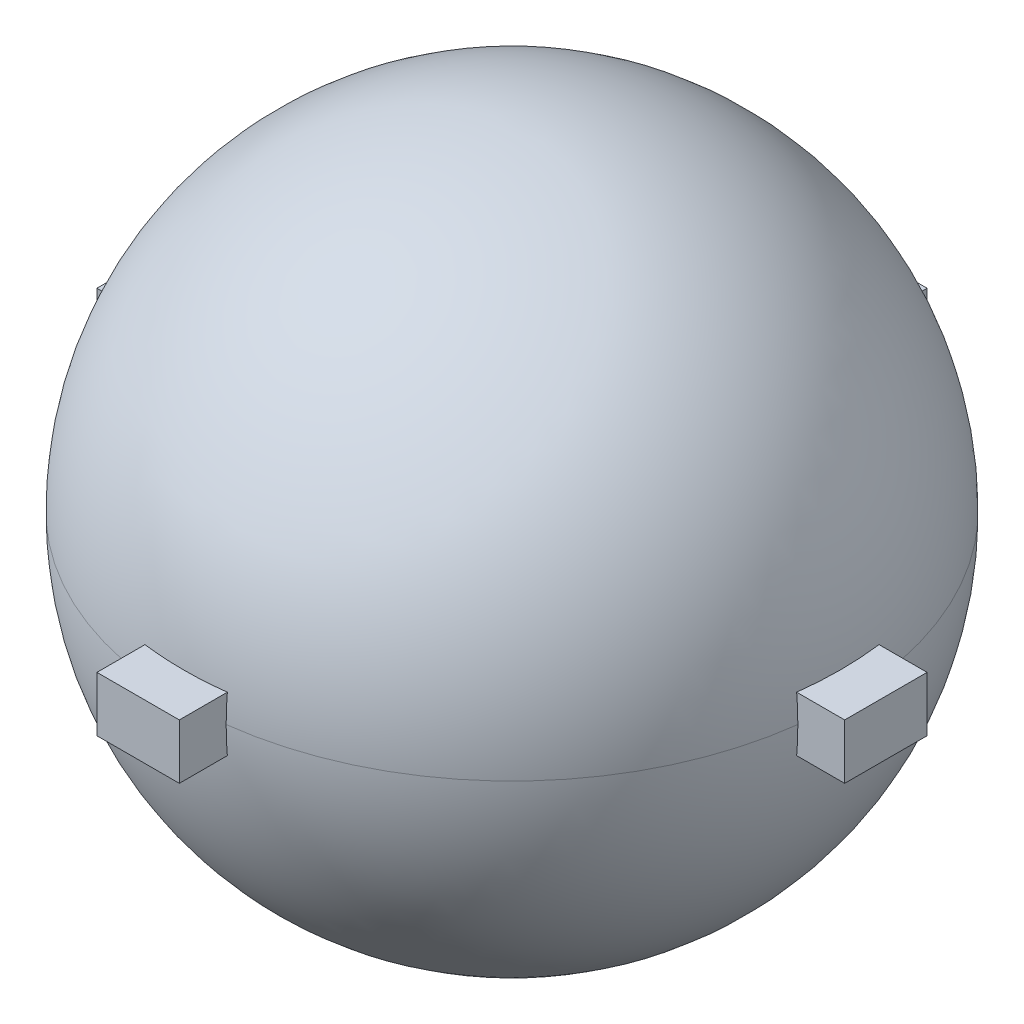
ISO-10303-21;
HEADER;
FILE_DESCRIPTION(('STEP AP214'),'2;1');
FILE_NAME('part.step','',(''),(''),'','','');
FILE_SCHEMA(('AUTOMOTIVE_DESIGN { 1 0 10303 214 1 1 1 1 }'));
ENDSEC;
DATA;
#1=APPLICATION_CONTEXT('core data for automotive mechanical design processes');
#2=APPLICATION_PROTOCOL_DEFINITION('international standard','automotive_design',2000,#1);
#3=PRODUCT_CONTEXT('',#1,'mechanical');
#4=PRODUCT('Part','Part','',(#3));
#5=PRODUCT_RELATED_PRODUCT_CATEGORY('part','',(#4));
#6=PRODUCT_DEFINITION_FORMATION('','',#4);
#7=PRODUCT_DEFINITION_CONTEXT('part definition',#1,'design');
#8=PRODUCT_DEFINITION('design','',#6,#7);
#9=PRODUCT_DEFINITION_SHAPE('','',#8);
#10=(LENGTH_UNIT() NAMED_UNIT(*) SI_UNIT(.MILLI.,.METRE.));
#11=(NAMED_UNIT(*) PLANE_ANGLE_UNIT() SI_UNIT($,.RADIAN.));
#12=(NAMED_UNIT(*) SI_UNIT($,.STERADIAN.) SOLID_ANGLE_UNIT());
#13=UNCERTAINTY_MEASURE_WITH_UNIT(LENGTH_MEASURE(1.E-05),#10,'distance_accuracy_value','');
#14=(GEOMETRIC_REPRESENTATION_CONTEXT(3) GLOBAL_UNCERTAINTY_ASSIGNED_CONTEXT((#13)) GLOBAL_UNIT_ASSIGNED_CONTEXT((#10,
#11,#12)) REPRESENTATION_CONTEXT('',''));
#15=CARTESIAN_POINT('',(0.,0.,0.));
#16=DIRECTION('',(0.,0.,1.));
#17=DIRECTION('',(1.,0.,0.));
#18=AXIS2_PLACEMENT_3D('',#15,#16,#17);
#19=CARTESIAN_POINT('',(0.,304.8,0.));
#20=DIRECTION('',(0.,1.,0.));
#21=DIRECTION('',(0.,0.,1.));
#22=AXIS2_PLACEMENT_3D('',#19,#20,#21);
#23=SPHERICAL_SURFACE('',#22,304.8);
#24=CARTESIAN_POINT('',(-38.1,304.8,-3.9907631702977E-13));
#25=DIRECTION('',(-1.,0.,0.));
#26=DIRECTION('',(0.,0.,1.));
#27=AXIS2_PLACEMENT_3D('',#24,#25,#26);
#28=CIRCLE('',#27,302.409374854683);
#29=CARTESIAN_POINT('',(-38.0999999999969,330.2,-301.340787149699));
#30=VERTEX_POINT('',#29);
#31=CARTESIAN_POINT('',(-38.0999999999968,304.8,-302.409374854683));
#32=VERTEX_POINT('',#31);
#33=EDGE_CURVE('E187',#30,#32,#28,.T.);
#34=ORIENTED_EDGE('',*,*,#33,.T.);
#35=CARTESIAN_POINT('',(0.,304.8,0.));
#36=DIRECTION('',(0.,-1.,0.));
#37=DIRECTION('',(0.,0.,-1.));
#38=AXIS2_PLACEMENT_3D('',#35,#36,#37);
#39=CIRCLE('',#38,304.8);
#40=CARTESIAN_POINT('',(-302.409374854683,304.8,-38.1));
#41=VERTEX_POINT('',#40);
#42=EDGE_CURVE('E341',#41,#32,#39,.T.);
#43=ORIENTED_EDGE('',*,*,#42,.F.);
#44=CARTESIAN_POINT('',(0.,304.8,-38.1));
#45=DIRECTION('',(0.,0.,-1.));
#46=DIRECTION('',(-1.,0.,0.));
#47=AXIS2_PLACEMENT_3D('',#44,#45,#46);
#48=CIRCLE('',#47,302.409374854683);
#49=CARTESIAN_POINT('',(-301.340787149699,330.2,-38.1));
#50=VERTEX_POINT('',#49);
#51=EDGE_CURVE('E217',#41,#50,#48,.T.);
#52=ORIENTED_EDGE('',*,*,#51,.T.);
#53=CARTESIAN_POINT('',(0.,330.2,0.));
#54=DIRECTION('',(0.,1.,0.));
#55=DIRECTION('',(0.,0.,1.));
#56=AXIS2_PLACEMENT_3D('',#53,#54,#55);
#57=CIRCLE('',#56,303.739822874776);
#58=CARTESIAN_POINT('',(-301.340787149699,330.2,38.1));
#59=VERTEX_POINT('',#58);
#60=EDGE_CURVE('E222',#50,#59,#57,.T.);
#61=ORIENTED_EDGE('',*,*,#60,.T.);
#62=CARTESIAN_POINT('',(0.,304.8,38.1));
#63=DIRECTION('',(0.,0.,1.));
#64=DIRECTION('',(1.,0.,0.));
#65=AXIS2_PLACEMENT_3D('',#62,#63,#64);
#66=CIRCLE('',#65,302.409374854683);
#67=CARTESIAN_POINT('',(-302.409374854683,304.8,38.1));
#68=VERTEX_POINT('',#67);
#69=EDGE_CURVE('E219',#59,#68,#66,.T.);
#70=ORIENTED_EDGE('',*,*,#69,.T.);
#71=CARTESIAN_POINT('',(-38.100000000001,304.8,302.409374854683));
#72=VERTEX_POINT('',#71);
#73=EDGE_CURVE('E307',#72,#68,#39,.T.);
#74=ORIENTED_EDGE('',*,*,#73,.F.);
#75=CARTESIAN_POINT('',(-38.1,304.8,-1.33025439009923E-13));
#76=DIRECTION('',(-1.,0.,0.));
#77=DIRECTION('',(0.,0.,1.));
#78=AXIS2_PLACEMENT_3D('',#75,#76,#77);
#79=CIRCLE('',#78,302.409374854683);
#80=CARTESIAN_POINT('',(-38.100000000001,330.2,301.340787149699));
#81=VERTEX_POINT('',#80);
#82=EDGE_CURVE('E247',#72,#81,#79,.T.);
#83=ORIENTED_EDGE('',*,*,#82,.T.);
#84=CARTESIAN_POINT('',(0.,330.2,0.));
#85=DIRECTION('',(0.,1.,0.));
#86=DIRECTION('',(0.,0.,1.));
#87=AXIS2_PLACEMENT_3D('',#84,#85,#86);
#88=CIRCLE('',#87,303.739822874776);
#89=CARTESIAN_POINT('',(38.099999999999,330.2,301.340787149699));
#90=VERTEX_POINT('',#89);
#91=EDGE_CURVE('E252',#81,#90,#88,.T.);
#92=ORIENTED_EDGE('',*,*,#91,.T.);
#93=CARTESIAN_POINT('',(38.1,304.8,1.33025439009923E-13));
#94=DIRECTION('',(1.,0.,0.));
#95=DIRECTION('',(0.,0.,-1.));
#96=AXIS2_PLACEMENT_3D('',#93,#94,#95);
#97=CIRCLE('',#96,302.409374854683);
#98=CARTESIAN_POINT('',(38.099999999999,304.8,302.409374854683));
#99=VERTEX_POINT('',#98);
#100=EDGE_CURVE('E249',#90,#99,#97,.T.);
#101=ORIENTED_EDGE('',*,*,#100,.T.);
#102=CARTESIAN_POINT('',(302.409374854683,304.8,38.1));
#103=VERTEX_POINT('',#102);
#104=EDGE_CURVE('E304',#103,#99,#39,.T.);
#105=ORIENTED_EDGE('',*,*,#104,.F.);
#106=CARTESIAN_POINT('',(0.,304.8,38.1));
#107=DIRECTION('',(0.,0.,1.));
#108=DIRECTION('',(1.,0.,0.));
#109=AXIS2_PLACEMENT_3D('',#106,#107,#108);
#110=CIRCLE('',#109,302.409374854683);
#111=CARTESIAN_POINT('',(301.340787149699,330.2,38.1));
#112=VERTEX_POINT('',#111);
#113=EDGE_CURVE('E299',#103,#112,#110,.T.);
#114=ORIENTED_EDGE('',*,*,#113,.T.);
#115=CARTESIAN_POINT('',(0.,330.2,0.));
#116=DIRECTION('',(0.,1.,0.));
#117=DIRECTION('',(0.,0.,1.));
#118=AXIS2_PLACEMENT_3D('',#115,#116,#117);
#119=CIRCLE('',#118,303.739822874776);
#120=CARTESIAN_POINT('',(301.340787149699,330.2,-38.1));
#121=VERTEX_POINT('',#120);
#122=EDGE_CURVE('E294',#112,#121,#119,.T.);
#123=ORIENTED_EDGE('',*,*,#122,.T.);
#124=CARTESIAN_POINT('',(0.,304.8,-38.1));
#125=DIRECTION('',(0.,0.,-1.));
#126=DIRECTION('',(-1.,0.,0.));
#127=AXIS2_PLACEMENT_3D('',#124,#125,#126);
#128=CIRCLE('',#127,302.409374854683);
#129=CARTESIAN_POINT('',(302.409374854683,304.8,-38.1));
#130=VERTEX_POINT('',#129);
#131=EDGE_CURVE('E277',#121,#130,#128,.T.);
#132=ORIENTED_EDGE('',*,*,#131,.T.);
#133=CARTESIAN_POINT('',(38.1000000000031,304.8,-302.409374854682));
#134=VERTEX_POINT('',#133);
#135=EDGE_CURVE('E296',#134,#130,#39,.T.);
#136=ORIENTED_EDGE('',*,*,#135,.F.);
#137=CARTESIAN_POINT('',(38.1,304.8,3.9907631702977E-13));
#138=DIRECTION('',(1.,0.,0.));
#139=DIRECTION('',(0.,0.,-1.));
#140=AXIS2_PLACEMENT_3D('',#137,#138,#139);
#141=CIRCLE('',#140,302.409374854683);
#142=CARTESIAN_POINT('',(38.1000000000031,330.2,-301.340787149698));
#143=VERTEX_POINT('',#142);
#144=EDGE_CURVE('E63',#134,#143,#141,.T.);
#145=ORIENTED_EDGE('',*,*,#144,.T.);
#146=CARTESIAN_POINT('',(0.,330.2,0.));
#147=DIRECTION('',(0.,1.,0.));
#148=DIRECTION('',(0.,0.,1.));
#149=AXIS2_PLACEMENT_3D('',#146,#147,#148);
#150=CIRCLE('',#149,303.739822874776);
#151=EDGE_CURVE('E58',#143,#30,#150,.T.);
#152=ORIENTED_EDGE('',*,*,#151,.T.);
#153=EDGE_LOOP('',(#34,#43,#52,#61,#70,#74,#83,#92,#101,#105,#114,#123,#132,#136,#145,#152));
#154=FACE_BOUND('',#153,.T.);
#155=ADVANCED_FACE('F42',(#154),#23,.T.);
#156=CARTESIAN_POINT('',(0.,304.8,0.));
#157=DIRECTION('',(0.,1.,0.));
#158=DIRECTION('',(0.,0.,1.));
#159=AXIS2_PLACEMENT_3D('',#156,#157,#158);
#160=SPHERICAL_SURFACE('',#159,304.8);
#161=CARTESIAN_POINT('',(-38.1,304.8,-3.9907631702977E-13));
#162=DIRECTION('',(-1.,0.,0.));
#163=DIRECTION('',(0.,0.,1.));
#164=AXIS2_PLACEMENT_3D('',#161,#162,#163);
#165=CIRCLE('',#164,302.409374854683);
#166=CARTESIAN_POINT('',(-38.0999999999969,279.4,-301.340787149699));
#167=VERTEX_POINT('',#166);
#168=EDGE_CURVE('E11',#167,#32,#165,.F.);
#169=ORIENTED_EDGE('',*,*,#168,.F.);
#170=CARTESIAN_POINT('',(0.,279.4,0.));
#171=DIRECTION('',(0.,-1.,0.));
#172=DIRECTION('',(0.,0.,-1.));
#173=AXIS2_PLACEMENT_3D('',#170,#171,#172);
#174=CIRCLE('',#173,303.739822874776);
#175=CARTESIAN_POINT('',(38.1000000000031,279.4,-301.340787149698));
#176=VERTEX_POINT('',#175);
#177=EDGE_CURVE('E179',#167,#176,#174,.T.);
#178=ORIENTED_EDGE('',*,*,#177,.T.);
#179=EDGE_CURVE('E182',#176,#134,#141,.T.);
#180=ORIENTED_EDGE('',*,*,#179,.T.);
#181=ORIENTED_EDGE('',*,*,#135,.T.);
#182=CARTESIAN_POINT('',(0.,304.8,-38.1));
#183=DIRECTION('',(0.,0.,-1.));
#184=DIRECTION('',(-1.,0.,0.));
#185=AXIS2_PLACEMENT_3D('',#182,#183,#184);
#186=CIRCLE('',#185,302.409374854683);
#187=CARTESIAN_POINT('',(301.340787149699,279.4,-38.1));
#188=VERTEX_POINT('',#187);
#189=EDGE_CURVE('E310',#188,#130,#186,.F.);
#190=ORIENTED_EDGE('',*,*,#189,.F.);
#191=CARTESIAN_POINT('',(0.,279.4,0.));
#192=DIRECTION('',(0.,-1.,0.));
#193=DIRECTION('',(0.,0.,-1.));
#194=AXIS2_PLACEMENT_3D('',#191,#192,#193);
#195=CIRCLE('',#194,303.739822874776);
#196=CARTESIAN_POINT('',(301.340787149699,279.4,38.1));
#197=VERTEX_POINT('',#196);
#198=EDGE_CURVE('E300',#188,#197,#195,.T.);
#199=ORIENTED_EDGE('',*,*,#198,.T.);
#200=EDGE_CURVE('E297',#197,#103,#110,.T.);
#201=ORIENTED_EDGE('',*,*,#200,.T.);
#202=ORIENTED_EDGE('',*,*,#104,.T.);
#203=CARTESIAN_POINT('',(38.1,304.8,1.33025439009923E-13));
#204=DIRECTION('',(1.,0.,0.));
#205=DIRECTION('',(0.,0.,-1.));
#206=AXIS2_PLACEMENT_3D('',#203,#204,#205);
#207=CIRCLE('',#206,302.409374854683);
#208=CARTESIAN_POINT('',(38.099999999999,279.4,301.340787149699));
#209=VERTEX_POINT('',#208);
#210=EDGE_CURVE('E313',#209,#99,#207,.F.);
#211=ORIENTED_EDGE('',*,*,#210,.F.);
#212=CARTESIAN_POINT('',(0.,279.4,0.));
#213=DIRECTION('',(0.,-1.,0.));
#214=DIRECTION('',(0.,0.,-1.));
#215=AXIS2_PLACEMENT_3D('',#212,#213,#214);
#216=CIRCLE('',#215,303.739822874776);
#217=CARTESIAN_POINT('',(-38.100000000001,279.4,301.340787149699));
#218=VERTEX_POINT('',#217);
#219=EDGE_CURVE('E246',#209,#218,#216,.T.);
#220=ORIENTED_EDGE('',*,*,#219,.T.);
#221=EDGE_CURVE('E244',#218,#72,#79,.T.);
#222=ORIENTED_EDGE('',*,*,#221,.T.);
#223=ORIENTED_EDGE('',*,*,#73,.T.);
#224=CARTESIAN_POINT('',(0.,304.8,38.1));
#225=DIRECTION('',(0.,0.,1.));
#226=DIRECTION('',(1.,0.,0.));
#227=AXIS2_PLACEMENT_3D('',#224,#225,#226);
#228=CIRCLE('',#227,302.409374854683);
#229=CARTESIAN_POINT('',(-301.340787149699,279.4,38.1));
#230=VERTEX_POINT('',#229);
#231=EDGE_CURVE('E51',#230,#68,#228,.F.);
#232=ORIENTED_EDGE('',*,*,#231,.F.);
#233=CARTESIAN_POINT('',(0.,279.4,0.));
#234=DIRECTION('',(0.,-1.,0.));
#235=DIRECTION('',(0.,0.,-1.));
#236=AXIS2_PLACEMENT_3D('',#233,#234,#235);
#237=CIRCLE('',#236,303.739822874776);
#238=CARTESIAN_POINT('',(-301.340787149699,279.4,-38.1));
#239=VERTEX_POINT('',#238);
#240=EDGE_CURVE('E216',#230,#239,#237,.T.);
#241=ORIENTED_EDGE('',*,*,#240,.T.);
#242=EDGE_CURVE('E214',#239,#41,#48,.T.);
#243=ORIENTED_EDGE('',*,*,#242,.T.);
#244=ORIENTED_EDGE('',*,*,#42,.T.);
#245=EDGE_LOOP('',(#169,#178,#180,#181,#190,#199,#201,#202,#211,#220,#222,#223,#232,#241,#243,#244));
#246=FACE_BOUND('',#245,.T.);
#247=ADVANCED_FACE('F181',(#246),#160,.T.);
#248=CARTESIAN_POINT('',(-304.801,279.4,-38.1));
#249=DIRECTION('',(0.,0.,-1.));
#250=DIRECTION('',(-1.,0.,0.));
#251=AXIS2_PLACEMENT_3D('',#248,#249,#250);
#252=PLANE('',#251);
#253=ORIENTED_EDGE('',*,*,#131,.F.);
#254=DIRECTION('',(1.,0.,0.));
#255=VECTOR('',#254,1.);
#256=CARTESIAN_POINT('',(-304.801,330.2,-38.1));
#257=LINE('',#256,#255);
#258=CARTESIAN_POINT('',(345.7575,330.2,-38.1));
#259=VERTEX_POINT('',#258);
#260=EDGE_CURVE('E273',#121,#259,#257,.T.);
#261=ORIENTED_EDGE('',*,*,#260,.T.);
#262=DIRECTION('',(0.,1.,0.));
#263=VECTOR('',#262,1.);
#264=CARTESIAN_POINT('',(345.7575,279.4,-38.1));
#265=LINE('',#264,#263);
#266=CARTESIAN_POINT('',(345.7575,279.4,-38.1));
#267=VERTEX_POINT('',#266);
#268=EDGE_CURVE('E284',#267,#259,#265,.T.);
#269=ORIENTED_EDGE('',*,*,#268,.F.);
#270=DIRECTION('',(1.,0.,0.));
#271=VECTOR('',#270,1.);
#272=CARTESIAN_POINT('',(-304.801,279.4,-38.1));
#273=LINE('',#272,#271);
#274=EDGE_CURVE('E288',#188,#267,#273,.T.);
#275=ORIENTED_EDGE('',*,*,#274,.F.);
#276=ORIENTED_EDGE('',*,*,#189,.T.);
#277=EDGE_LOOP('',(#253,#261,#269,#275,#276));
#278=FACE_BOUND('',#277,.T.);
#279=ADVANCED_FACE('F348',(#278),#252,.T.);
#280=CARTESIAN_POINT('',(-304.801,279.4,38.1));
#281=DIRECTION('',(0.,-1.,0.));
#282=DIRECTION('',(0.,0.,-1.));
#283=AXIS2_PLACEMENT_3D('',#280,#281,#282);
#284=PLANE('',#283);
#285=ORIENTED_EDGE('',*,*,#198,.F.);
#286=ORIENTED_EDGE('',*,*,#274,.T.);
#287=DIRECTION('',(0.,0.,-1.));
#288=VECTOR('',#287,1.);
#289=CARTESIAN_POINT('',(345.7575,279.4,38.1));
#290=LINE('',#289,#288);
#291=CARTESIAN_POINT('',(345.7575,279.4,38.1));
#292=VERTEX_POINT('',#291);
#293=EDGE_CURVE('E274',#292,#267,#290,.T.);
#294=ORIENTED_EDGE('',*,*,#293,.F.);
#295=DIRECTION('',(1.,0.,0.));
#296=VECTOR('',#295,1.);
#297=CARTESIAN_POINT('',(-304.801,279.4,38.1));
#298=LINE('',#297,#296);
#299=EDGE_CURVE('E287',#197,#292,#298,.T.);
#300=ORIENTED_EDGE('',*,*,#299,.F.);
#301=EDGE_LOOP('',(#285,#286,#294,#300));
#302=FACE_BOUND('',#301,.T.);
#303=ADVANCED_FACE('F352',(#302),#284,.T.);
#304=CARTESIAN_POINT('',(-304.801,330.2,38.1));
#305=DIRECTION('',(0.,1.,0.));
#306=DIRECTION('',(0.,0.,1.));
#307=AXIS2_PLACEMENT_3D('',#304,#305,#306);
#308=PLANE('',#307);
#309=ORIENTED_EDGE('',*,*,#122,.F.);
#310=DIRECTION('',(1.,0.,0.));
#311=VECTOR('',#310,1.);
#312=CARTESIAN_POINT('',(-304.801,330.2,38.1));
#313=LINE('',#312,#311);
#314=CARTESIAN_POINT('',(345.7575,330.2,38.1));
#315=VERTEX_POINT('',#314);
#316=EDGE_CURVE('E290',#112,#315,#313,.T.);
#317=ORIENTED_EDGE('',*,*,#316,.T.);
#318=DIRECTION('',(0.,0.,1.));
#319=VECTOR('',#318,1.);
#320=CARTESIAN_POINT('',(345.7575,330.2,38.1));
#321=LINE('',#320,#319);
#322=EDGE_CURVE('E281',#259,#315,#321,.T.);
#323=ORIENTED_EDGE('',*,*,#322,.F.);
#324=ORIENTED_EDGE('',*,*,#260,.F.);
#325=EDGE_LOOP('',(#309,#317,#323,#324));
#326=FACE_BOUND('',#325,.T.);
#327=ADVANCED_FACE('F426',(#326),#308,.T.);
#328=CARTESIAN_POINT('',(-304.801,279.4,38.1));
#329=DIRECTION('',(0.,0.,1.));
#330=DIRECTION('',(1.,0.,0.));
#331=AXIS2_PLACEMENT_3D('',#328,#329,#330);
#332=PLANE('',#331);
#333=ORIENTED_EDGE('',*,*,#200,.F.);
#334=ORIENTED_EDGE('',*,*,#299,.T.);
#335=DIRECTION('',(0.,-1.,0.));
#336=VECTOR('',#335,1.);
#337=CARTESIAN_POINT('',(345.7575,279.4,38.1));
#338=LINE('',#337,#336);
#339=EDGE_CURVE('E278',#315,#292,#338,.T.);
#340=ORIENTED_EDGE('',*,*,#339,.F.);
#341=ORIENTED_EDGE('',*,*,#316,.F.);
#342=ORIENTED_EDGE('',*,*,#113,.F.);
#343=EDGE_LOOP('',(#333,#334,#340,#341,#342));
#344=FACE_BOUND('',#343,.T.);
#345=ADVANCED_FACE('F358',(#344),#332,.T.);
#346=CARTESIAN_POINT('',(345.7575,0.,0.));
#347=DIRECTION('',(-1.,0.,0.));
#348=DIRECTION('',(0.,0.,1.));
#349=AXIS2_PLACEMENT_3D('',#346,#347,#348);
#350=PLANE('',#349);
#351=ORIENTED_EDGE('',*,*,#268,.T.);
#352=ORIENTED_EDGE('',*,*,#322,.T.);
#353=ORIENTED_EDGE('',*,*,#339,.T.);
#354=ORIENTED_EDGE('',*,*,#293,.T.);
#355=EDGE_LOOP('',(#351,#352,#353,#354));
#356=FACE_BOUND('',#355,.T.);
#357=ADVANCED_FACE('F391',(#356),#350,.F.);
#358=CARTESIAN_POINT('',(-1.20720585901505E-12,0.,345.7575));
#359=DIRECTION('',(0.,0.,-1.));
#360=DIRECTION('',(-1.,0.,0.));
#361=AXIS2_PLACEMENT_3D('',#358,#359,#360);
#362=PLANE('',#361);
#363=DIRECTION('',(0.,1.,0.));
#364=VECTOR('',#363,1.);
#365=CARTESIAN_POINT('',(38.0999999999988,279.4,345.7575));
#366=LINE('',#365,#364);
#367=CARTESIAN_POINT('',(38.0999999999988,279.4,345.7575));
#368=VERTEX_POINT('',#367);
#369=CARTESIAN_POINT('',(38.0999999999988,330.2,345.7575));
#370=VERTEX_POINT('',#369);
#371=EDGE_CURVE('E243',#368,#370,#366,.T.);
#372=ORIENTED_EDGE('',*,*,#371,.T.);
#373=DIRECTION('',(-1.,0.,0.));
#374=VECTOR('',#373,1.);
#375=CARTESIAN_POINT('',(-38.1000000000012,330.2,345.7575));
#376=LINE('',#375,#374);
#377=CARTESIAN_POINT('',(-38.1000000000012,330.2,345.7575));
#378=VERTEX_POINT('',#377);
#379=EDGE_CURVE('E255',#370,#378,#376,.T.);
#380=ORIENTED_EDGE('',*,*,#379,.T.);
#381=DIRECTION('',(0.,-1.,0.));
#382=VECTOR('',#381,1.);
#383=CARTESIAN_POINT('',(-38.1000000000012,279.4,345.7575));
#384=LINE('',#383,#382);
#385=CARTESIAN_POINT('',(-38.1000000000012,279.4,345.7575));
#386=VERTEX_POINT('',#385);
#387=EDGE_CURVE('E258',#378,#386,#384,.T.);
#388=ORIENTED_EDGE('',*,*,#387,.T.);
#389=DIRECTION('',(1.,0.,0.));
#390=VECTOR('',#389,1.);
#391=CARTESIAN_POINT('',(-38.1000000000012,279.4,345.7575));
#392=LINE('',#391,#390);
#393=EDGE_CURVE('E261',#386,#368,#392,.T.);
#394=ORIENTED_EDGE('',*,*,#393,.T.);
#395=EDGE_LOOP('',(#372,#380,#388,#394));
#396=FACE_BOUND('',#395,.T.);
#397=ADVANCED_FACE('F375',(#396),#362,.F.);
#398=CARTESIAN_POINT('',(-38.0999999999989,330.2,-304.801000000001));
#399=DIRECTION('',(0.,1.,0.));
#400=DIRECTION('',(0.,0.,1.));
#401=AXIS2_PLACEMENT_3D('',#398,#399,#400);
#402=PLANE('',#401);
#403=ORIENTED_EDGE('',*,*,#91,.F.);
#404=DIRECTION('',(0.,0.,1.));
#405=VECTOR('',#404,1.);
#406=CARTESIAN_POINT('',(-38.0999999999989,330.2,-304.801000000001));
#407=LINE('',#406,#405);
#408=EDGE_CURVE('E269',#81,#378,#407,.T.);
#409=ORIENTED_EDGE('',*,*,#408,.T.);
#410=ORIENTED_EDGE('',*,*,#379,.F.);
#411=DIRECTION('',(0.,0.,1.));
#412=VECTOR('',#411,1.);
#413=CARTESIAN_POINT('',(38.1000000000011,330.2,-304.801000000001));
#414=LINE('',#413,#412);
#415=EDGE_CURVE('E264',#90,#370,#414,.T.);
#416=ORIENTED_EDGE('',*,*,#415,.F.);
#417=EDGE_LOOP('',(#403,#409,#410,#416));
#418=FACE_BOUND('',#417,.T.);
#419=ADVANCED_FACE('F383',(#418),#402,.T.);
#420=CARTESIAN_POINT('',(-38.0999999999989,279.4,-304.801000000001));
#421=DIRECTION('',(-1.,0.,0.));
#422=DIRECTION('',(0.,0.,1.));
#423=AXIS2_PLACEMENT_3D('',#420,#421,#422);
#424=PLANE('',#423);
#425=ORIENTED_EDGE('',*,*,#221,.F.);
#426=DIRECTION('',(0.,0.,1.));
#427=VECTOR('',#426,1.);
#428=CARTESIAN_POINT('',(-38.0999999999989,279.4,-304.801000000001));
#429=LINE('',#428,#427);
#430=EDGE_CURVE('E267',#218,#386,#429,.T.);
#431=ORIENTED_EDGE('',*,*,#430,.T.);
#432=ORIENTED_EDGE('',*,*,#387,.F.);
#433=ORIENTED_EDGE('',*,*,#408,.F.);
#434=ORIENTED_EDGE('',*,*,#82,.F.);
#435=EDGE_LOOP('',(#425,#431,#432,#433,#434));
#436=FACE_BOUND('',#435,.T.);
#437=ADVANCED_FACE('F379',(#436),#424,.T.);
#438=CARTESIAN_POINT('',(-38.0999999999989,279.4,-304.801000000001));
#439=DIRECTION('',(0.,-1.,0.));
#440=DIRECTION('',(0.,0.,-1.));
#441=AXIS2_PLACEMENT_3D('',#438,#439,#440);
#442=PLANE('',#441);
#443=ORIENTED_EDGE('',*,*,#219,.F.);
#444=DIRECTION('',(0.,0.,1.));
#445=VECTOR('',#444,1.);
#446=CARTESIAN_POINT('',(38.1000000000011,279.4,-304.801000000001));
#447=LINE('',#446,#445);
#448=EDGE_CURVE('E265',#209,#368,#447,.T.);
#449=ORIENTED_EDGE('',*,*,#448,.T.);
#450=ORIENTED_EDGE('',*,*,#393,.F.);
#451=ORIENTED_EDGE('',*,*,#430,.F.);
#452=EDGE_LOOP('',(#443,#449,#450,#451));
#453=FACE_BOUND('',#452,.T.);
#454=ADVANCED_FACE('F368',(#453),#442,.T.);
#455=CARTESIAN_POINT('',(38.1000000000011,279.4,-304.801000000001));
#456=DIRECTION('',(1.,0.,0.));
#457=DIRECTION('',(0.,0.,-1.));
#458=AXIS2_PLACEMENT_3D('',#455,#456,#457);
#459=PLANE('',#458);
#460=ORIENTED_EDGE('',*,*,#100,.F.);
#461=ORIENTED_EDGE('',*,*,#415,.T.);
#462=ORIENTED_EDGE('',*,*,#371,.F.);
#463=ORIENTED_EDGE('',*,*,#448,.F.);
#464=ORIENTED_EDGE('',*,*,#210,.T.);
#465=EDGE_LOOP('',(#460,#461,#462,#463,#464));
#466=FACE_BOUND('',#465,.T.);
#467=ADVANCED_FACE('F371',(#466),#459,.T.);
#468=CARTESIAN_POINT('',(-345.7575,0.,0.));
#469=DIRECTION('',(1.,0.,0.));
#470=DIRECTION('',(0.,0.,-1.));
#471=AXIS2_PLACEMENT_3D('',#468,#469,#470);
#472=PLANE('',#471);
#473=DIRECTION('',(0.,1.,0.));
#474=VECTOR('',#473,1.);
#475=CARTESIAN_POINT('',(-345.7575,279.4,38.1));
#476=LINE('',#475,#474);
#477=CARTESIAN_POINT('',(-345.7575,279.4,38.1));
#478=VERTEX_POINT('',#477);
#479=CARTESIAN_POINT('',(-345.7575,330.2,38.1));
#480=VERTEX_POINT('',#479);
#481=EDGE_CURVE('E211',#478,#480,#476,.T.);
#482=ORIENTED_EDGE('',*,*,#481,.T.);
#483=DIRECTION('',(0.,0.,-1.));
#484=VECTOR('',#483,1.);
#485=CARTESIAN_POINT('',(-345.7575,330.2,-38.1));
#486=LINE('',#485,#484);
#487=CARTESIAN_POINT('',(-345.7575,330.2,-38.1));
#488=VERTEX_POINT('',#487);
#489=EDGE_CURVE('E225',#480,#488,#486,.T.);
#490=ORIENTED_EDGE('',*,*,#489,.T.);
#491=DIRECTION('',(0.,-1.,0.));
#492=VECTOR('',#491,1.);
#493=CARTESIAN_POINT('',(-345.7575,279.4,-38.1));
#494=LINE('',#493,#492);
#495=CARTESIAN_POINT('',(-345.7575,279.4,-38.1));
#496=VERTEX_POINT('',#495);
#497=EDGE_CURVE('E228',#488,#496,#494,.T.);
#498=ORIENTED_EDGE('',*,*,#497,.T.);
#499=DIRECTION('',(0.,0.,1.));
#500=VECTOR('',#499,1.);
#501=CARTESIAN_POINT('',(-345.7575,279.4,-38.1));
#502=LINE('',#501,#500);
#503=EDGE_CURVE('E231',#496,#478,#502,.T.);
#504=ORIENTED_EDGE('',*,*,#503,.T.);
#505=EDGE_LOOP('',(#482,#490,#498,#504));
#506=FACE_BOUND('',#505,.T.);
#507=ADVANCED_FACE('F335',(#506),#472,.F.);
#508=CARTESIAN_POINT('',(345.7585,330.2,-38.1));
#509=DIRECTION('',(0.,1.,0.));
#510=DIRECTION('',(0.,0.,1.));
#511=AXIS2_PLACEMENT_3D('',#508,#509,#510);
#512=PLANE('',#511);
#513=ORIENTED_EDGE('',*,*,#60,.F.);
#514=DIRECTION('',(-1.,0.,0.));
#515=VECTOR('',#514,1.);
#516=CARTESIAN_POINT('',(345.7585,330.2,-38.1));
#517=LINE('',#516,#515);
#518=EDGE_CURVE('E239',#50,#488,#517,.T.);
#519=ORIENTED_EDGE('',*,*,#518,.T.);
#520=ORIENTED_EDGE('',*,*,#489,.F.);
#521=DIRECTION('',(-1.,0.,0.));
#522=VECTOR('',#521,1.);
#523=CARTESIAN_POINT('',(345.7585,330.2,38.1));
#524=LINE('',#523,#522);
#525=EDGE_CURVE('E234',#59,#480,#524,.T.);
#526=ORIENTED_EDGE('',*,*,#525,.F.);
#527=EDGE_LOOP('',(#513,#519,#520,#526));
#528=FACE_BOUND('',#527,.T.);
#529=ADVANCED_FACE('F339',(#528),#512,.T.);
#530=CARTESIAN_POINT('',(345.7585,279.4,-38.1));
#531=DIRECTION('',(0.,0.,-1.));
#532=DIRECTION('',(-1.,0.,0.));
#533=AXIS2_PLACEMENT_3D('',#530,#531,#532);
#534=PLANE('',#533);
#535=ORIENTED_EDGE('',*,*,#242,.F.);
#536=DIRECTION('',(-1.,0.,0.));
#537=VECTOR('',#536,1.);
#538=CARTESIAN_POINT('',(345.7585,279.4,-38.1));
#539=LINE('',#538,#537);
#540=EDGE_CURVE('E237',#239,#496,#539,.T.);
#541=ORIENTED_EDGE('',*,*,#540,.T.);
#542=ORIENTED_EDGE('',*,*,#497,.F.);
#543=ORIENTED_EDGE('',*,*,#518,.F.);
#544=ORIENTED_EDGE('',*,*,#51,.F.);
#545=EDGE_LOOP('',(#535,#541,#542,#543,#544));
#546=FACE_BOUND('',#545,.T.);
#547=ADVANCED_FACE('F331',(#546),#534,.T.);
#548=CARTESIAN_POINT('',(345.7585,279.4,-38.1));
#549=DIRECTION('',(0.,-1.,0.));
#550=DIRECTION('',(0.,0.,-1.));
#551=AXIS2_PLACEMENT_3D('',#548,#549,#550);
#552=PLANE('',#551);
#553=ORIENTED_EDGE('',*,*,#240,.F.);
#554=DIRECTION('',(-1.,0.,0.));
#555=VECTOR('',#554,1.);
#556=CARTESIAN_POINT('',(345.7585,279.4,38.1));
#557=LINE('',#556,#555);
#558=EDGE_CURVE('E235',#230,#478,#557,.T.);
#559=ORIENTED_EDGE('',*,*,#558,.T.);
#560=ORIENTED_EDGE('',*,*,#503,.F.);
#561=ORIENTED_EDGE('',*,*,#540,.F.);
#562=EDGE_LOOP('',(#553,#559,#560,#561));
#563=FACE_BOUND('',#562,.T.);
#564=ADVANCED_FACE('F327',(#563),#552,.T.);
#565=CARTESIAN_POINT('',(345.7585,279.4,38.1));
#566=DIRECTION('',(0.,0.,1.));
#567=DIRECTION('',(1.,0.,0.));
#568=AXIS2_PLACEMENT_3D('',#565,#566,#567);
#569=PLANE('',#568);
#570=ORIENTED_EDGE('',*,*,#69,.F.);
#571=ORIENTED_EDGE('',*,*,#525,.T.);
#572=ORIENTED_EDGE('',*,*,#481,.F.);
#573=ORIENTED_EDGE('',*,*,#558,.F.);
#574=ORIENTED_EDGE('',*,*,#231,.T.);
#575=EDGE_LOOP('',(#570,#571,#572,#573,#574));
#576=FACE_BOUND('',#575,.T.);
#577=ADVANCED_FACE('F319',(#576),#569,.T.);
#578=CARTESIAN_POINT('',(-38.1000000000032,279.4,304.801000000003));
#579=DIRECTION('',(-1.,0.,0.));
#580=DIRECTION('',(0.,0.,1.));
#581=AXIS2_PLACEMENT_3D('',#578,#579,#580);
#582=PLANE('',#581);
#583=ORIENTED_EDGE('',*,*,#33,.F.);
#584=DIRECTION('',(0.,0.,-1.));
#585=VECTOR('',#584,1.);
#586=CARTESIAN_POINT('',(-38.1000000000032,330.2,304.801000000003));
#587=LINE('',#586,#585);
#588=CARTESIAN_POINT('',(-38.0999999999964,330.2,-345.7575));
#589=VERTEX_POINT('',#588);
#590=EDGE_CURVE('E209',#30,#589,#587,.T.);
#591=ORIENTED_EDGE('',*,*,#590,.T.);
#592=DIRECTION('',(0.,1.,0.));
#593=VECTOR('',#592,1.);
#594=CARTESIAN_POINT('',(-38.0999999999964,279.4,-345.7575));
#595=LINE('',#594,#593);
#596=CARTESIAN_POINT('',(-38.0999999999964,279.4,-345.7575));
#597=VERTEX_POINT('',#596);
#598=EDGE_CURVE('E199',#597,#589,#595,.T.);
#599=ORIENTED_EDGE('',*,*,#598,.F.);
#600=DIRECTION('',(0.,0.,-1.));
#601=VECTOR('',#600,1.);
#602=CARTESIAN_POINT('',(-38.1000000000032,279.4,304.801000000003));
#603=LINE('',#602,#601);
#604=EDGE_CURVE('E200',#167,#597,#603,.T.);
#605=ORIENTED_EDGE('',*,*,#604,.F.);
#606=ORIENTED_EDGE('',*,*,#168,.T.);
#607=EDGE_LOOP('',(#583,#591,#599,#605,#606));
#608=FACE_BOUND('',#607,.T.);
#609=ADVANCED_FACE('F516',(#608),#582,.T.);
#610=CARTESIAN_POINT('',(38.0999999999968,330.2,304.801000000004));
#611=DIRECTION('',(0.,1.,0.));
#612=DIRECTION('',(0.,0.,1.));
#613=AXIS2_PLACEMENT_3D('',#610,#611,#612);
#614=PLANE('',#613);
#615=ORIENTED_EDGE('',*,*,#151,.F.);
#616=DIRECTION('',(0.,0.,-1.));
#617=VECTOR('',#616,1.);
#618=CARTESIAN_POINT('',(38.0999999999968,330.2,304.801000000004));
#619=LINE('',#618,#617);
#620=CARTESIAN_POINT('',(38.1000000000036,330.2,-345.7575));
#621=VERTEX_POINT('',#620);
#622=EDGE_CURVE('E205',#143,#621,#619,.T.);
#623=ORIENTED_EDGE('',*,*,#622,.T.);
#624=DIRECTION('',(1.,0.,0.));
#625=VECTOR('',#624,1.);
#626=CARTESIAN_POINT('',(38.1000000000036,330.2,-345.7575));
#627=LINE('',#626,#625);
#628=EDGE_CURVE('E203',#589,#621,#627,.T.);
#629=ORIENTED_EDGE('',*,*,#628,.F.);
#630=ORIENTED_EDGE('',*,*,#590,.F.);
#631=EDGE_LOOP('',(#615,#623,#629,#630));
#632=FACE_BOUND('',#631,.T.);
#633=ADVANCED_FACE('F525',(#632),#614,.T.);
#634=CARTESIAN_POINT('',(38.0999999999968,279.4,304.801000000004));
#635=DIRECTION('',(0.,-1.,0.));
#636=DIRECTION('',(0.,0.,-1.));
#637=AXIS2_PLACEMENT_3D('',#634,#635,#636);
#638=PLANE('',#637);
#639=ORIENTED_EDGE('',*,*,#177,.F.);
#640=ORIENTED_EDGE('',*,*,#604,.T.);
#641=DIRECTION('',(-1.,0.,0.));
#642=VECTOR('',#641,1.);
#643=CARTESIAN_POINT('',(38.1000000000036,279.4,-345.7575));
#644=LINE('',#643,#642);
#645=CARTESIAN_POINT('',(38.1000000000036,279.4,-345.7575));
#646=VERTEX_POINT('',#645);
#647=EDGE_CURVE('E198',#646,#597,#644,.T.);
#648=ORIENTED_EDGE('',*,*,#647,.F.);
#649=DIRECTION('',(0.,0.,-1.));
#650=VECTOR('',#649,1.);
#651=CARTESIAN_POINT('',(38.0999999999968,279.4,304.801000000004));
#652=LINE('',#651,#650);
#653=EDGE_CURVE('E192',#176,#646,#652,.T.);
#654=ORIENTED_EDGE('',*,*,#653,.F.);
#655=EDGE_LOOP('',(#639,#640,#648,#654));
#656=FACE_BOUND('',#655,.T.);
#657=ADVANCED_FACE('F196',(#656),#638,.T.);
#658=CARTESIAN_POINT('',(38.0999999999968,279.4,304.801000000004));
#659=DIRECTION('',(1.,0.,0.));
#660=DIRECTION('',(0.,0.,-1.));
#661=AXIS2_PLACEMENT_3D('',#658,#659,#660);
#662=PLANE('',#661);
#663=ORIENTED_EDGE('',*,*,#179,.F.);
#664=ORIENTED_EDGE('',*,*,#653,.T.);
#665=DIRECTION('',(0.,-1.,0.));
#666=VECTOR('',#665,1.);
#667=CARTESIAN_POINT('',(38.1000000000036,279.4,-345.7575));
#668=LINE('',#667,#666);
#669=EDGE_CURVE('E569',#621,#646,#668,.T.);
#670=ORIENTED_EDGE('',*,*,#669,.F.);
#671=ORIENTED_EDGE('',*,*,#622,.F.);
#672=ORIENTED_EDGE('',*,*,#144,.F.);
#673=EDGE_LOOP('',(#663,#664,#670,#671,#672));
#674=FACE_BOUND('',#673,.T.);
#675=ADVANCED_FACE('F190',(#674),#662,.T.);
#676=CARTESIAN_POINT('',(3.62161757704516E-12,0.,-345.7575));
#677=DIRECTION('',(0.,0.,1.));
#678=DIRECTION('',(1.,0.,0.));
#679=AXIS2_PLACEMENT_3D('',#676,#677,#678);
#680=PLANE('',#679);
#681=ORIENTED_EDGE('',*,*,#598,.T.);
#682=ORIENTED_EDGE('',*,*,#628,.T.);
#683=ORIENTED_EDGE('',*,*,#669,.T.);
#684=ORIENTED_EDGE('',*,*,#647,.T.);
#685=EDGE_LOOP('',(#681,#682,#683,#684));
#686=FACE_BOUND('',#685,.T.);
#687=ADVANCED_FACE('F552',(#686),#680,.F.);
#688=CLOSED_SHELL('',(#155,#247,#279,#303,#327,#345,#357,#397,#419,#437,#454,#467,#507,#529,
#547,#564,#577,#609,#633,#657,#675,#687));
#689=CARTESIAN_POINT('',(0.,304.8,0.));
#690=DIRECTION('',(0.,1.,0.));
#691=DIRECTION('',(0.,0.,1.));
#692=AXIS2_PLACEMENT_3D('',#689,#690,#691);
#693=SPHERICAL_SURFACE('',#692,301.625);
#694=CARTESIAN_POINT('',(0.,304.8,0.));
#695=DIRECTION('',(0.,1.,0.));
#696=DIRECTION('',(0.,0.,1.));
#697=AXIS2_PLACEMENT_3D('',#694,#695,#696);
#698=CIRCLE('',#697,301.625);
#699=CARTESIAN_POINT('',(0.,304.8,301.625));
#700=VERTEX_POINT('',#699);
#701=EDGE_CURVE('E306',#700,#700,#698,.F.);
#702=ORIENTED_EDGE('',*,*,#701,.T.);
#703=EDGE_LOOP('',(#702));
#704=FACE_BOUND('',#703,.T.);
#705=ADVANCED_FACE('F402',(#704),#693,.F.);
#706=CARTESIAN_POINT('',(0.,304.8,0.));
#707=DIRECTION('',(0.,1.,0.));
#708=DIRECTION('',(0.,0.,1.));
#709=AXIS2_PLACEMENT_3D('',#706,#707,#708);
#710=SPHERICAL_SURFACE('',#709,301.625);
#711=ORIENTED_EDGE('',*,*,#701,.F.);
#712=EDGE_LOOP('',(#711));
#713=FACE_BOUND('',#712,.T.);
#714=ADVANCED_FACE('F44',(#713),#710,.F.);
#715=CLOSED_SHELL('',(#705,#714));
#716=ORIENTED_CLOSED_SHELL('',*,#715,.T.);
#717=BREP_WITH_VOIDS('B2',#688,(#716));
#718=ADVANCED_BREP_SHAPE_REPRESENTATION('',(#18,#717),#14);
#719=SHAPE_DEFINITION_REPRESENTATION(#9,#718);
ENDSEC;
END-ISO-10303-21;
